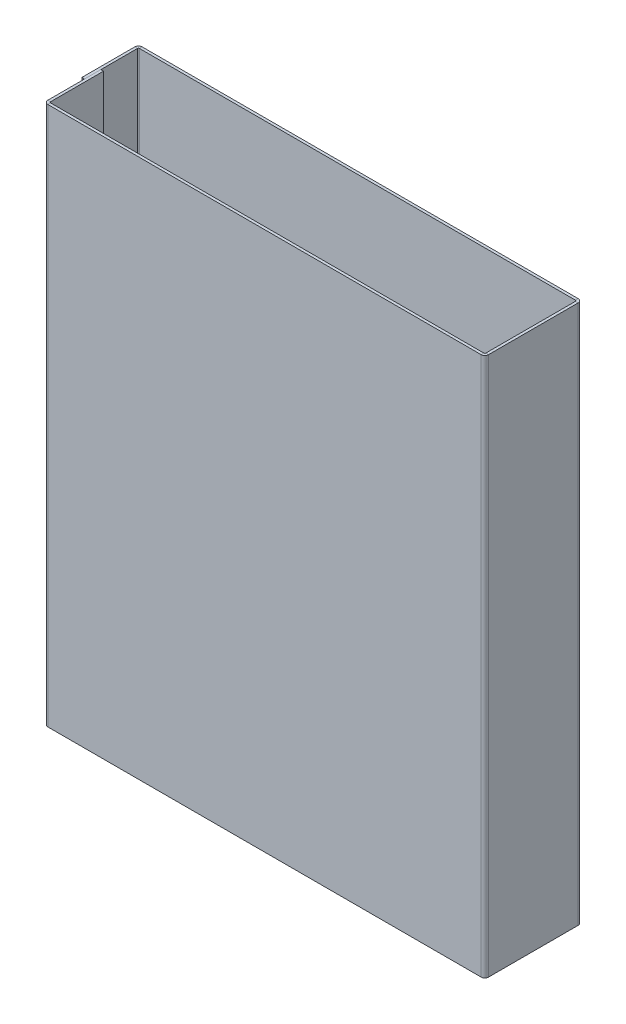
ISO-10303-21;
HEADER;
FILE_DESCRIPTION(('STEP AP214'),'2;1');
FILE_NAME('part.step','',(''),(''),'','','');
FILE_SCHEMA(('AUTOMOTIVE_DESIGN { 1 0 10303 214 1 1 1 1 }'));
ENDSEC;
DATA;
#1=APPLICATION_CONTEXT('core data for automotive mechanical design processes');
#2=APPLICATION_PROTOCOL_DEFINITION('international standard','automotive_design',2000,#1);
#3=PRODUCT_CONTEXT('',#1,'mechanical');
#4=PRODUCT('Part','Part','',(#3));
#5=PRODUCT_RELATED_PRODUCT_CATEGORY('part','',(#4));
#6=PRODUCT_DEFINITION_FORMATION('','',#4);
#7=PRODUCT_DEFINITION_CONTEXT('part definition',#1,'design');
#8=PRODUCT_DEFINITION('design','',#6,#7);
#9=PRODUCT_DEFINITION_SHAPE('','',#8);
#10=(LENGTH_UNIT() NAMED_UNIT(*) SI_UNIT(.MILLI.,.METRE.));
#11=(NAMED_UNIT(*) PLANE_ANGLE_UNIT() SI_UNIT($,.RADIAN.));
#12=(NAMED_UNIT(*) SI_UNIT($,.STERADIAN.) SOLID_ANGLE_UNIT());
#13=UNCERTAINTY_MEASURE_WITH_UNIT(LENGTH_MEASURE(1.E-05),#10,'distance_accuracy_value','');
#14=(GEOMETRIC_REPRESENTATION_CONTEXT(3) GLOBAL_UNCERTAINTY_ASSIGNED_CONTEXT((#13)) GLOBAL_UNIT_ASSIGNED_CONTEXT((#10,
#11,#12)) REPRESENTATION_CONTEXT('',''));
#15=CARTESIAN_POINT('',(0.,0.,0.));
#16=DIRECTION('',(0.,0.,1.));
#17=DIRECTION('',(1.,0.,0.));
#18=AXIS2_PLACEMENT_3D('',#15,#16,#17);
#19=CARTESIAN_POINT('',(-163.5,200.,2.));
#20=DIRECTION('',(0.,-1.,0.));
#21=DIRECTION('',(0.,0.,-1.));
#22=AXIS2_PLACEMENT_3D('',#19,#20,#21);
#23=PLANE('',#22);
#24=DIRECTION('',(0.,0.,-1.));
#25=VECTOR('',#24,1.);
#26=CARTESIAN_POINT('',(-162.7634,200.,1.99999999999999));
#27=LINE('',#26,#25);
#28=CARTESIAN_POINT('',(-162.7634,200.,1.99999999999999));
#29=VERTEX_POINT('',#28);
#30=CARTESIAN_POINT('',(-162.7634,200.,0.));
#31=VERTEX_POINT('',#30);
#32=EDGE_CURVE('E289',#29,#31,#27,.T.);
#33=ORIENTED_EDGE('',*,*,#32,.F.);
#34=DIRECTION('',(-1.,0.,0.));
#35=VECTOR('',#34,1.);
#36=CARTESIAN_POINT('',(-163.5,200.,2.));
#37=LINE('',#36,#35);
#38=CARTESIAN_POINT('',(160.7634,200.,2.));
#39=VERTEX_POINT('',#38);
#40=EDGE_CURVE('E101',#39,#29,#37,.T.);
#41=ORIENTED_EDGE('',*,*,#40,.F.);
#42=DIRECTION('',(0.,0.,-1.));
#43=VECTOR('',#42,1.);
#44=CARTESIAN_POINT('',(160.7634,200.,2.));
#45=LINE('',#44,#43);
#46=CARTESIAN_POINT('',(160.7634,200.,0.));
#47=VERTEX_POINT('',#46);
#48=EDGE_CURVE('E413',#39,#47,#45,.T.);
#49=ORIENTED_EDGE('',*,*,#48,.T.);
#50=DIRECTION('',(-1.,0.,0.));
#51=VECTOR('',#50,1.);
#52=CARTESIAN_POINT('',(-163.5,200.,0.));
#53=LINE('',#52,#51);
#54=EDGE_CURVE('E427',#47,#31,#53,.T.);
#55=ORIENTED_EDGE('',*,*,#54,.T.);
#56=EDGE_LOOP('',(#33,#41,#49,#55));
#57=FACE_BOUND('',#56,.T.);
#58=ADVANCED_FACE('F93',(#57),#23,.F.);
#59=CARTESIAN_POINT('',(-163.5,-200.,2.));
#60=DIRECTION('',(0.,1.,0.));
#61=DIRECTION('',(0.,0.,1.));
#62=AXIS2_PLACEMENT_3D('',#59,#60,#61);
#63=PLANE('',#62);
#64=DIRECTION('',(0.,0.,-1.));
#65=VECTOR('',#64,1.);
#66=CARTESIAN_POINT('',(-162.7634,-200.,1.99999999999999));
#67=LINE('',#66,#65);
#68=CARTESIAN_POINT('',(-162.7634,-200.,1.99999999999999));
#69=VERTEX_POINT('',#68);
#70=CARTESIAN_POINT('',(-162.7634,-200.,0.));
#71=VERTEX_POINT('',#70);
#72=EDGE_CURVE('E282',#69,#71,#67,.T.);
#73=ORIENTED_EDGE('',*,*,#72,.T.);
#74=DIRECTION('',(1.,0.,0.));
#75=VECTOR('',#74,1.);
#76=CARTESIAN_POINT('',(-163.5,-200.,0.));
#77=LINE('',#76,#75);
#78=CARTESIAN_POINT('',(160.7634,-200.,0.));
#79=VERTEX_POINT('',#78);
#80=EDGE_CURVE('E96',#71,#79,#77,.T.);
#81=ORIENTED_EDGE('',*,*,#80,.T.);
#82=DIRECTION('',(0.,0.,-1.));
#83=VECTOR('',#82,1.);
#84=CARTESIAN_POINT('',(160.7634,-200.,2.));
#85=LINE('',#84,#83);
#86=CARTESIAN_POINT('',(160.7634,-200.,2.));
#87=VERTEX_POINT('',#86);
#88=EDGE_CURVE('E424',#87,#79,#85,.T.);
#89=ORIENTED_EDGE('',*,*,#88,.F.);
#90=DIRECTION('',(1.,0.,0.));
#91=VECTOR('',#90,1.);
#92=CARTESIAN_POINT('',(-163.5,-200.,2.));
#93=LINE('',#92,#91);
#94=EDGE_CURVE('E13',#69,#87,#93,.T.);
#95=ORIENTED_EDGE('',*,*,#94,.F.);
#96=EDGE_LOOP('',(#73,#81,#89,#95));
#97=FACE_BOUND('',#96,.T.);
#98=ADVANCED_FACE('F439',(#97),#63,.F.);
#99=CARTESIAN_POINT('',(163.5,200.,2.));
#100=DIRECTION('',(0.,0.,-1.));
#101=DIRECTION('',(-1.,0.,0.));
#102=AXIS2_PLACEMENT_3D('',#99,#100,#101);
#103=PLANE('',#102);
#104=DIRECTION('',(0.,-1.,0.));
#105=VECTOR('',#104,1.);
#106=CARTESIAN_POINT('',(-162.7634,-200.,1.99999999999999));
#107=LINE('',#106,#105);
#108=EDGE_CURVE('E286',#69,#29,#107,.F.);
#109=ORIENTED_EDGE('',*,*,#108,.F.);
#110=ORIENTED_EDGE('',*,*,#94,.T.);
#111=DIRECTION('',(0.,1.,0.));
#112=VECTOR('',#111,1.);
#113=CARTESIAN_POINT('',(160.7634,200.,2.));
#114=LINE('',#113,#112);
#115=EDGE_CURVE('E419',#39,#87,#114,.F.);
#116=ORIENTED_EDGE('',*,*,#115,.F.);
#117=ORIENTED_EDGE('',*,*,#40,.T.);
#118=EDGE_LOOP('',(#109,#110,#116,#117));
#119=FACE_BOUND('',#118,.T.);
#120=ADVANCED_FACE('F452',(#119),#103,.F.);
#121=CARTESIAN_POINT('',(163.5,200.,0.));
#122=DIRECTION('',(0.,0.,-1.));
#123=DIRECTION('',(-1.,0.,0.));
#124=AXIS2_PLACEMENT_3D('',#121,#122,#123);
#125=PLANE('',#124);
#126=ORIENTED_EDGE('',*,*,#80,.F.);
#127=DIRECTION('',(0.,-1.,0.));
#128=VECTOR('',#127,1.);
#129=CARTESIAN_POINT('',(-162.7634,-200.,0.));
#130=LINE('',#129,#128);
#131=EDGE_CURVE('E236',#71,#31,#130,.F.);
#132=ORIENTED_EDGE('',*,*,#131,.T.);
#133=ORIENTED_EDGE('',*,*,#54,.F.);
#134=DIRECTION('',(0.,1.,0.));
#135=VECTOR('',#134,1.);
#136=CARTESIAN_POINT('',(160.7634,200.,0.));
#137=LINE('',#136,#135);
#138=EDGE_CURVE('E406',#47,#79,#137,.F.);
#139=ORIENTED_EDGE('',*,*,#138,.T.);
#140=EDGE_LOOP('',(#126,#132,#133,#139));
#141=FACE_BOUND('',#140,.T.);
#142=ADVANCED_FACE('F449',(#141),#125,.T.);
#143=CARTESIAN_POINT('',(-163.5,200.,72.0000000000023));
#144=DIRECTION('',(0.,-1.,0.));
#145=DIRECTION('',(0.,0.,-1.));
#146=AXIS2_PLACEMENT_3D('',#143,#144,#145);
#147=PLANE('',#146);
#148=DIRECTION('',(0.,0.,1.));
#149=VECTOR('',#148,1.);
#150=CARTESIAN_POINT('',(-160.7634,200.,70.0000000000023));
#151=LINE('',#150,#149);
#152=CARTESIAN_POINT('',(-160.7634,200.,70.0000000000023));
#153=VERTEX_POINT('',#152);
#154=CARTESIAN_POINT('',(-160.7634,200.,72.0000000000023));
#155=VERTEX_POINT('',#154);
#156=EDGE_CURVE('E329',#153,#155,#151,.T.);
#157=ORIENTED_EDGE('',*,*,#156,.T.);
#158=DIRECTION('',(-1.,0.,0.));
#159=VECTOR('',#158,1.);
#160=CARTESIAN_POINT('',(161.5,200.,72.));
#161=LINE('',#160,#159);
#162=CARTESIAN_POINT('',(160.7634,200.,72.));
#163=VERTEX_POINT('',#162);
#164=EDGE_CURVE('E347',#163,#155,#161,.T.);
#165=ORIENTED_EDGE('',*,*,#164,.F.);
#166=DIRECTION('',(0.,0.,-1.));
#167=VECTOR('',#166,1.);
#168=CARTESIAN_POINT('',(160.7634,200.,70.));
#169=LINE('',#168,#167);
#170=CARTESIAN_POINT('',(160.7634,200.,70.));
#171=VERTEX_POINT('',#170);
#172=EDGE_CURVE('E356',#171,#163,#169,.F.);
#173=ORIENTED_EDGE('',*,*,#172,.F.);
#174=DIRECTION('',(1.,0.,0.));
#175=VECTOR('',#174,1.);
#176=CARTESIAN_POINT('',(-163.5,200.,70.0000000000023));
#177=LINE('',#176,#175);
#178=EDGE_CURVE('E351',#171,#153,#177,.F.);
#179=ORIENTED_EDGE('',*,*,#178,.T.);
#180=EDGE_LOOP('',(#157,#165,#173,#179));
#181=FACE_BOUND('',#180,.T.);
#182=ADVANCED_FACE('F451',(#181),#147,.F.);
#183=CARTESIAN_POINT('',(161.5,-200.,72.));
#184=DIRECTION('',(0.,1.,0.));
#185=DIRECTION('',(0.,0.,1.));
#186=AXIS2_PLACEMENT_3D('',#183,#184,#185);
#187=PLANE('',#186);
#188=DIRECTION('',(0.,0.,1.));
#189=VECTOR('',#188,1.);
#190=CARTESIAN_POINT('',(-160.7634,-200.,70.0000000000023));
#191=LINE('',#190,#189);
#192=CARTESIAN_POINT('',(-160.7634,-200.,70.0000000000023));
#193=VERTEX_POINT('',#192);
#194=CARTESIAN_POINT('',(-160.7634,-200.,72.0000000000023));
#195=VERTEX_POINT('',#194);
#196=EDGE_CURVE('E338',#193,#195,#191,.T.);
#197=ORIENTED_EDGE('',*,*,#196,.F.);
#198=DIRECTION('',(-1.,0.,0.));
#199=VECTOR('',#198,1.);
#200=CARTESIAN_POINT('',(161.5,-200.,70.));
#201=LINE('',#200,#199);
#202=CARTESIAN_POINT('',(160.7634,-200.,70.));
#203=VERTEX_POINT('',#202);
#204=EDGE_CURVE('E349',#193,#203,#201,.F.);
#205=ORIENTED_EDGE('',*,*,#204,.T.);
#206=DIRECTION('',(0.,0.,-1.));
#207=VECTOR('',#206,1.);
#208=CARTESIAN_POINT('',(160.7634,-200.,72.));
#209=LINE('',#208,#207);
#210=CARTESIAN_POINT('',(160.7634,-200.,72.));
#211=VERTEX_POINT('',#210);
#212=EDGE_CURVE('E341',#203,#211,#209,.F.);
#213=ORIENTED_EDGE('',*,*,#212,.T.);
#214=DIRECTION('',(1.,0.,0.));
#215=VECTOR('',#214,1.);
#216=CARTESIAN_POINT('',(161.5,-200.,72.));
#217=LINE('',#216,#215);
#218=EDGE_CURVE('E344',#195,#211,#217,.T.);
#219=ORIENTED_EDGE('',*,*,#218,.F.);
#220=EDGE_LOOP('',(#197,#205,#213,#219));
#221=FACE_BOUND('',#220,.T.);
#222=ADVANCED_FACE('F458',(#221),#187,.F.);
#223=CARTESIAN_POINT('',(161.5,-200.,72.));
#224=DIRECTION('',(0.,0.,-1.));
#225=DIRECTION('',(-1.,0.,0.));
#226=AXIS2_PLACEMENT_3D('',#223,#224,#225);
#227=PLANE('',#226);
#228=DIRECTION('',(0.,1.,0.));
#229=VECTOR('',#228,1.);
#230=CARTESIAN_POINT('',(-160.7634,200.,72.0000000000023));
#231=LINE('',#230,#229);
#232=EDGE_CURVE('E323',#155,#195,#231,.F.);
#233=ORIENTED_EDGE('',*,*,#232,.T.);
#234=ORIENTED_EDGE('',*,*,#218,.T.);
#235=DIRECTION('',(0.,1.,0.));
#236=VECTOR('',#235,1.);
#237=CARTESIAN_POINT('',(160.7634,-200.,72.));
#238=LINE('',#237,#236);
#239=EDGE_CURVE('E353',#163,#211,#238,.F.);
#240=ORIENTED_EDGE('',*,*,#239,.F.);
#241=ORIENTED_EDGE('',*,*,#164,.T.);
#242=EDGE_LOOP('',(#233,#234,#240,#241));
#243=FACE_BOUND('',#242,.T.);
#244=ADVANCED_FACE('F548',(#243),#227,.F.);
#245=CARTESIAN_POINT('',(161.5,-200.,70.));
#246=DIRECTION('',(0.,0.,-1.));
#247=DIRECTION('',(-1.,0.,0.));
#248=AXIS2_PLACEMENT_3D('',#245,#246,#247);
#249=PLANE('',#248);
#250=ORIENTED_EDGE('',*,*,#204,.F.);
#251=DIRECTION('',(0.,1.,0.));
#252=VECTOR('',#251,1.);
#253=CARTESIAN_POINT('',(-160.7634,200.,70.0000000000023));
#254=LINE('',#253,#252);
#255=EDGE_CURVE('E117',#153,#193,#254,.F.);
#256=ORIENTED_EDGE('',*,*,#255,.F.);
#257=ORIENTED_EDGE('',*,*,#178,.F.);
#258=DIRECTION('',(0.,1.,0.));
#259=VECTOR('',#258,1.);
#260=CARTESIAN_POINT('',(160.7634,-200.,70.));
#261=LINE('',#260,#259);
#262=EDGE_CURVE('E359',#203,#171,#261,.T.);
#263=ORIENTED_EDGE('',*,*,#262,.F.);
#264=EDGE_LOOP('',(#250,#256,#257,#263));
#265=FACE_BOUND('',#264,.T.);
#266=ADVANCED_FACE('F498',(#265),#249,.T.);
#267=CARTESIAN_POINT('',(163.5,200.,72.));
#268=DIRECTION('',(0.,-1.,0.));
#269=DIRECTION('',(0.,0.,-1.));
#270=AXIS2_PLACEMENT_3D('',#267,#268,#269);
#271=PLANE('',#270);
#272=DIRECTION('',(1.,0.,0.));
#273=VECTOR('',#272,1.);
#274=CARTESIAN_POINT('',(161.5,200.,69.2634));
#275=LINE('',#274,#273);
#276=CARTESIAN_POINT('',(161.5,200.,69.2634));
#277=VERTEX_POINT('',#276);
#278=CARTESIAN_POINT('',(163.5,200.,69.2634));
#279=VERTEX_POINT('',#278);
#280=EDGE_CURVE('E369',#277,#279,#275,.T.);
#281=ORIENTED_EDGE('',*,*,#280,.T.);
#282=DIRECTION('',(0.,0.,1.));
#283=VECTOR('',#282,1.);
#284=CARTESIAN_POINT('',(163.5,200.,1.99999999999999));
#285=LINE('',#284,#283);
#286=CARTESIAN_POINT('',(163.5,200.,2.7366));
#287=VERTEX_POINT('',#286);
#288=EDGE_CURVE('E389',#287,#279,#285,.T.);
#289=ORIENTED_EDGE('',*,*,#288,.F.);
#290=DIRECTION('',(-1.,0.,0.));
#291=VECTOR('',#290,1.);
#292=CARTESIAN_POINT('',(161.5,200.,2.73660000000001));
#293=LINE('',#292,#291);
#294=CARTESIAN_POINT('',(161.5,200.,2.73660000000001));
#295=VERTEX_POINT('',#294);
#296=EDGE_CURVE('E399',#295,#287,#293,.F.);
#297=ORIENTED_EDGE('',*,*,#296,.F.);
#298=DIRECTION('',(0.,0.,-1.));
#299=VECTOR('',#298,1.);
#300=CARTESIAN_POINT('',(161.5,200.,72.));
#301=LINE('',#300,#299);
#302=EDGE_CURVE('E393',#295,#277,#301,.F.);
#303=ORIENTED_EDGE('',*,*,#302,.T.);
#304=EDGE_LOOP('',(#281,#289,#297,#303));
#305=FACE_BOUND('',#304,.T.);
#306=ADVANCED_FACE('F482',(#305),#271,.F.);
#307=CARTESIAN_POINT('',(163.5,-200.,1.99999999999999));
#308=DIRECTION('',(0.,1.,0.));
#309=DIRECTION('',(0.,0.,1.));
#310=AXIS2_PLACEMENT_3D('',#307,#308,#309);
#311=PLANE('',#310);
#312=DIRECTION('',(1.,0.,0.));
#313=VECTOR('',#312,1.);
#314=CARTESIAN_POINT('',(161.5,-200.,69.2634));
#315=LINE('',#314,#313);
#316=CARTESIAN_POINT('',(161.5,-200.,69.2634));
#317=VERTEX_POINT('',#316);
#318=CARTESIAN_POINT('',(163.5,-200.,69.2634));
#319=VERTEX_POINT('',#318);
#320=EDGE_CURVE('E380',#317,#319,#315,.T.);
#321=ORIENTED_EDGE('',*,*,#320,.F.);
#322=DIRECTION('',(0.,0.,1.));
#323=VECTOR('',#322,1.);
#324=CARTESIAN_POINT('',(161.5,-200.,2.));
#325=LINE('',#324,#323);
#326=CARTESIAN_POINT('',(161.5,-200.,2.73660000000001));
#327=VERTEX_POINT('',#326);
#328=EDGE_CURVE('E391',#317,#327,#325,.F.);
#329=ORIENTED_EDGE('',*,*,#328,.T.);
#330=DIRECTION('',(-1.,0.,0.));
#331=VECTOR('',#330,1.);
#332=CARTESIAN_POINT('',(163.5,-200.,2.7366));
#333=LINE('',#332,#331);
#334=CARTESIAN_POINT('',(163.5,-200.,2.7366));
#335=VERTEX_POINT('',#334);
#336=EDGE_CURVE('E383',#327,#335,#333,.F.);
#337=ORIENTED_EDGE('',*,*,#336,.T.);
#338=DIRECTION('',(0.,0.,-1.));
#339=VECTOR('',#338,1.);
#340=CARTESIAN_POINT('',(163.5,-200.,1.99999999999999));
#341=LINE('',#340,#339);
#342=EDGE_CURVE('E386',#319,#335,#341,.T.);
#343=ORIENTED_EDGE('',*,*,#342,.F.);
#344=EDGE_LOOP('',(#321,#329,#337,#343));
#345=FACE_BOUND('',#344,.T.);
#346=ADVANCED_FACE('F571',(#345),#311,.F.);
#347=CARTESIAN_POINT('',(163.5,200.,1.99999999999999));
#348=DIRECTION('',(-1.,0.,0.));
#349=DIRECTION('',(0.,0.,1.));
#350=AXIS2_PLACEMENT_3D('',#347,#348,#349);
#351=PLANE('',#350);
#352=DIRECTION('',(0.,1.,0.));
#353=VECTOR('',#352,1.);
#354=CARTESIAN_POINT('',(163.5,200.,69.2634));
#355=LINE('',#354,#353);
#356=EDGE_CURVE('E363',#279,#319,#355,.F.);
#357=ORIENTED_EDGE('',*,*,#356,.T.);
#358=ORIENTED_EDGE('',*,*,#342,.T.);
#359=DIRECTION('',(0.,1.,0.));
#360=VECTOR('',#359,1.);
#361=CARTESIAN_POINT('',(163.5,-200.,2.7366));
#362=LINE('',#361,#360);
#363=EDGE_CURVE('E396',#287,#335,#362,.F.);
#364=ORIENTED_EDGE('',*,*,#363,.F.);
#365=ORIENTED_EDGE('',*,*,#288,.T.);
#366=EDGE_LOOP('',(#357,#358,#364,#365));
#367=FACE_BOUND('',#366,.T.);
#368=ADVANCED_FACE('F568',(#367),#351,.F.);
#369=CARTESIAN_POINT('',(161.5,200.,2.));
#370=DIRECTION('',(-1.,0.,0.));
#371=DIRECTION('',(0.,0.,1.));
#372=AXIS2_PLACEMENT_3D('',#369,#370,#371);
#373=PLANE('',#372);
#374=ORIENTED_EDGE('',*,*,#328,.F.);
#375=DIRECTION('',(0.,1.,0.));
#376=VECTOR('',#375,1.);
#377=CARTESIAN_POINT('',(161.5,200.,69.2634));
#378=LINE('',#377,#376);
#379=EDGE_CURVE('E375',#277,#317,#378,.F.);
#380=ORIENTED_EDGE('',*,*,#379,.F.);
#381=ORIENTED_EDGE('',*,*,#302,.F.);
#382=DIRECTION('',(0.,1.,0.));
#383=VECTOR('',#382,1.);
#384=CARTESIAN_POINT('',(161.5,-200.,2.73660000000001));
#385=LINE('',#384,#383);
#386=EDGE_CURVE('E402',#327,#295,#385,.T.);
#387=ORIENTED_EDGE('',*,*,#386,.F.);
#388=EDGE_LOOP('',(#374,#380,#381,#387));
#389=FACE_BOUND('',#388,.T.);
#390=ADVANCED_FACE('F486',(#389),#373,.T.);
#391=CARTESIAN_POINT('',(160.7634,-200.,2.73660000000001));
#392=DIRECTION('',(0.,-1.,0.));
#393=DIRECTION('',(0.,0.,-1.));
#394=AXIS2_PLACEMENT_3D('',#391,#392,#393);
#395=PLANE('',#394);
#396=ORIENTED_EDGE('',*,*,#336,.F.);
#397=CARTESIAN_POINT('',(160.7634,-200.,2.73660000000001));
#398=DIRECTION('',(0.,1.,0.));
#399=DIRECTION('',(0.,0.,1.));
#400=AXIS2_PLACEMENT_3D('',#397,#398,#399);
#401=CIRCLE('',#400,0.736600000000004);
#402=EDGE_CURVE('E416',#87,#327,#401,.F.);
#403=ORIENTED_EDGE('',*,*,#402,.F.);
#404=ORIENTED_EDGE('',*,*,#88,.T.);
#405=CARTESIAN_POINT('',(160.7634,-200.,2.73660000000001));
#406=DIRECTION('',(0.,1.,0.));
#407=DIRECTION('',(0.,0.,1.));
#408=AXIS2_PLACEMENT_3D('',#405,#406,#407);
#409=CIRCLE('',#408,2.7366);
#410=EDGE_CURVE('E409',#79,#335,#409,.F.);
#411=ORIENTED_EDGE('',*,*,#410,.T.);
#412=EDGE_LOOP('',(#396,#403,#404,#411));
#413=FACE_BOUND('',#412,.T.);
#414=ADVANCED_FACE('F448',(#413),#395,.T.);
#415=CARTESIAN_POINT('',(160.7634,200.,2.73660000000001));
#416=DIRECTION('',(0.,-1.,0.));
#417=DIRECTION('',(0.,0.,-1.));
#418=AXIS2_PLACEMENT_3D('',#415,#416,#417);
#419=PLANE('',#418);
#420=CARTESIAN_POINT('',(160.7634,200.,2.73660000000001));
#421=DIRECTION('',(0.,1.,0.));
#422=DIRECTION('',(0.,0.,1.));
#423=AXIS2_PLACEMENT_3D('',#420,#421,#422);
#424=CIRCLE('',#423,0.736600000000004);
#425=EDGE_CURVE('E388',#295,#39,#424,.T.);
#426=ORIENTED_EDGE('',*,*,#425,.F.);
#427=ORIENTED_EDGE('',*,*,#296,.T.);
#428=CARTESIAN_POINT('',(160.7634,200.,2.73660000000001));
#429=DIRECTION('',(0.,1.,0.));
#430=DIRECTION('',(0.,0.,1.));
#431=AXIS2_PLACEMENT_3D('',#428,#429,#430);
#432=CIRCLE('',#431,2.7366);
#433=EDGE_CURVE('E410',#287,#47,#432,.T.);
#434=ORIENTED_EDGE('',*,*,#433,.T.);
#435=ORIENTED_EDGE('',*,*,#48,.F.);
#436=EDGE_LOOP('',(#426,#427,#434,#435));
#437=FACE_BOUND('',#436,.T.);
#438=ADVANCED_FACE('F478',(#437),#419,.F.);
#439=CARTESIAN_POINT('',(160.7634,200.,2.73660000000001));
#440=DIRECTION('',(0.,1.,0.));
#441=DIRECTION('',(1.,0.,0.));
#442=AXIS2_PLACEMENT_3D('',#439,#440,#441);
#443=CYLINDRICAL_SURFACE('',#442,2.7366);
#444=ORIENTED_EDGE('',*,*,#138,.F.);
#445=ORIENTED_EDGE('',*,*,#433,.F.);
#446=ORIENTED_EDGE('',*,*,#363,.T.);
#447=ORIENTED_EDGE('',*,*,#410,.F.);
#448=EDGE_LOOP('',(#444,#445,#446,#447));
#449=FACE_BOUND('',#448,.T.);
#450=ADVANCED_FACE('F443',(#449),#443,.T.);
#451=CARTESIAN_POINT('',(160.7634,200.,2.73660000000001));
#452=DIRECTION('',(0.,1.,0.));
#453=DIRECTION('',(1.,0.,0.));
#454=AXIS2_PLACEMENT_3D('',#451,#452,#453);
#455=CYLINDRICAL_SURFACE('',#454,0.736600000000004);
#456=ORIENTED_EDGE('',*,*,#115,.T.);
#457=ORIENTED_EDGE('',*,*,#402,.T.);
#458=ORIENTED_EDGE('',*,*,#386,.T.);
#459=ORIENTED_EDGE('',*,*,#425,.T.);
#460=EDGE_LOOP('',(#456,#457,#458,#459));
#461=FACE_BOUND('',#460,.T.);
#462=ADVANCED_FACE('F473',(#461),#455,.F.);
#463=CARTESIAN_POINT('',(160.7634,-200.,69.2634));
#464=DIRECTION('',(0.,-1.,0.));
#465=DIRECTION('',(0.,0.,-1.));
#466=AXIS2_PLACEMENT_3D('',#463,#464,#465);
#467=PLANE('',#466);
#468=ORIENTED_EDGE('',*,*,#212,.F.);
#469=CARTESIAN_POINT('',(160.7634,-200.,69.2634));
#470=DIRECTION('',(0.,1.,0.));
#471=DIRECTION('',(0.,0.,1.));
#472=AXIS2_PLACEMENT_3D('',#469,#470,#471);
#473=CIRCLE('',#472,0.736600000000004);
#474=EDGE_CURVE('E372',#317,#203,#473,.F.);
#475=ORIENTED_EDGE('',*,*,#474,.F.);
#476=ORIENTED_EDGE('',*,*,#320,.T.);
#477=CARTESIAN_POINT('',(160.7634,-200.,69.2634));
#478=DIRECTION('',(0.,1.,0.));
#479=DIRECTION('',(0.,0.,1.));
#480=AXIS2_PLACEMENT_3D('',#477,#478,#479);
#481=CIRCLE('',#480,2.7366);
#482=EDGE_CURVE('E365',#319,#211,#481,.F.);
#483=ORIENTED_EDGE('',*,*,#482,.T.);
#484=EDGE_LOOP('',(#468,#475,#476,#483));
#485=FACE_BOUND('',#484,.T.);
#486=ADVANCED_FACE('F494',(#485),#467,.T.);
#487=CARTESIAN_POINT('',(160.7634,200.,69.2634));
#488=DIRECTION('',(0.,-1.,0.));
#489=DIRECTION('',(0.,0.,-1.));
#490=AXIS2_PLACEMENT_3D('',#487,#488,#489);
#491=PLANE('',#490);
#492=CARTESIAN_POINT('',(160.7634,200.,69.2634));
#493=DIRECTION('',(0.,1.,0.));
#494=DIRECTION('',(0.,0.,1.));
#495=AXIS2_PLACEMENT_3D('',#492,#493,#494);
#496=CIRCLE('',#495,0.736600000000004);
#497=EDGE_CURVE('E346',#171,#277,#496,.T.);
#498=ORIENTED_EDGE('',*,*,#497,.F.);
#499=ORIENTED_EDGE('',*,*,#172,.T.);
#500=CARTESIAN_POINT('',(160.7634,200.,69.2634));
#501=DIRECTION('',(0.,1.,0.));
#502=DIRECTION('',(0.,0.,1.));
#503=AXIS2_PLACEMENT_3D('',#500,#501,#502);
#504=CIRCLE('',#503,2.7366);
#505=EDGE_CURVE('E366',#163,#279,#504,.T.);
#506=ORIENTED_EDGE('',*,*,#505,.T.);
#507=ORIENTED_EDGE('',*,*,#280,.F.);
#508=EDGE_LOOP('',(#498,#499,#506,#507));
#509=FACE_BOUND('',#508,.T.);
#510=ADVANCED_FACE('F559',(#509),#491,.F.);
#511=CARTESIAN_POINT('',(160.7634,200.,69.2634));
#512=DIRECTION('',(0.,1.,0.));
#513=DIRECTION('',(0.,0.,1.));
#514=AXIS2_PLACEMENT_3D('',#511,#512,#513);
#515=CYLINDRICAL_SURFACE('',#514,2.7366);
#516=ORIENTED_EDGE('',*,*,#356,.F.);
#517=ORIENTED_EDGE('',*,*,#505,.F.);
#518=ORIENTED_EDGE('',*,*,#239,.T.);
#519=ORIENTED_EDGE('',*,*,#482,.F.);
#520=EDGE_LOOP('',(#516,#517,#518,#519));
#521=FACE_BOUND('',#520,.T.);
#522=ADVANCED_FACE('F556',(#521),#515,.T.);
#523=CARTESIAN_POINT('',(160.7634,200.,69.2634));
#524=DIRECTION('',(0.,1.,0.));
#525=DIRECTION('',(0.,0.,1.));
#526=AXIS2_PLACEMENT_3D('',#523,#524,#525);
#527=CYLINDRICAL_SURFACE('',#526,0.736600000000004);
#528=ORIENTED_EDGE('',*,*,#379,.T.);
#529=ORIENTED_EDGE('',*,*,#474,.T.);
#530=ORIENTED_EDGE('',*,*,#262,.T.);
#531=ORIENTED_EDGE('',*,*,#497,.T.);
#532=EDGE_LOOP('',(#528,#529,#530,#531));
#533=FACE_BOUND('',#532,.T.);
#534=ADVANCED_FACE('F489',(#533),#527,.F.);
#535=CARTESIAN_POINT('',(-160.7634,-200.,69.2634000000023));
#536=DIRECTION('',(0.,-1.,0.));
#537=DIRECTION('',(0.,0.,-1.));
#538=AXIS2_PLACEMENT_3D('',#535,#536,#537);
#539=PLANE('',#538);
#540=DIRECTION('',(1.,0.,0.));
#541=VECTOR('',#540,1.);
#542=CARTESIAN_POINT('',(-163.5,-200.,69.2634000000023));
#543=LINE('',#542,#541);
#544=CARTESIAN_POINT('',(-161.5,-200.,69.2634000000023));
#545=VERTEX_POINT('',#544);
#546=CARTESIAN_POINT('',(-163.5,-200.,69.2634000000023));
#547=VERTEX_POINT('',#546);
#548=EDGE_CURVE('E291',#545,#547,#543,.F.);
#549=ORIENTED_EDGE('',*,*,#548,.F.);
#550=CARTESIAN_POINT('',(-160.7634,-200.,69.2634000000023));
#551=DIRECTION('',(0.,1.,0.));
#552=DIRECTION('',(0.,0.,1.));
#553=AXIS2_PLACEMENT_3D('',#550,#551,#552);
#554=CIRCLE('',#553,0.736600000000004);
#555=EDGE_CURVE('E332',#193,#545,#554,.F.);
#556=ORIENTED_EDGE('',*,*,#555,.F.);
#557=ORIENTED_EDGE('',*,*,#196,.T.);
#558=CARTESIAN_POINT('',(-160.7634,-200.,69.2634000000023));
#559=DIRECTION('',(0.,1.,0.));
#560=DIRECTION('',(0.,0.,1.));
#561=AXIS2_PLACEMENT_3D('',#558,#559,#560);
#562=CIRCLE('',#561,2.7366);
#563=EDGE_CURVE('E325',#195,#547,#562,.F.);
#564=ORIENTED_EDGE('',*,*,#563,.T.);
#565=EDGE_LOOP('',(#549,#556,#557,#564));
#566=FACE_BOUND('',#565,.T.);
#567=ADVANCED_FACE('F505',(#566),#539,.T.);
#568=CARTESIAN_POINT('',(-160.7634,200.,69.2634000000023));
#569=DIRECTION('',(0.,-1.,0.));
#570=DIRECTION('',(0.,0.,-1.));
#571=AXIS2_PLACEMENT_3D('',#568,#569,#570);
#572=PLANE('',#571);
#573=CARTESIAN_POINT('',(-160.7634,200.,69.2634000000023));
#574=DIRECTION('',(0.,1.,0.));
#575=DIRECTION('',(0.,0.,1.));
#576=AXIS2_PLACEMENT_3D('',#573,#574,#575);
#577=CIRCLE('',#576,0.736600000000004);
#578=CARTESIAN_POINT('',(-161.5,200.,69.2634000000023));
#579=VERTEX_POINT('',#578);
#580=EDGE_CURVE('E296',#579,#153,#577,.T.);
#581=ORIENTED_EDGE('',*,*,#580,.F.);
#582=DIRECTION('',(1.,0.,0.));
#583=VECTOR('',#582,1.);
#584=CARTESIAN_POINT('',(-161.5,200.,69.2634000000023));
#585=LINE('',#584,#583);
#586=CARTESIAN_POINT('',(-163.5,200.,69.2634000000023));
#587=VERTEX_POINT('',#586);
#588=EDGE_CURVE('E316',#579,#587,#585,.F.);
#589=ORIENTED_EDGE('',*,*,#588,.T.);
#590=CARTESIAN_POINT('',(-160.7634,200.,69.2634000000023));
#591=DIRECTION('',(0.,1.,0.));
#592=DIRECTION('',(0.,0.,1.));
#593=AXIS2_PLACEMENT_3D('',#590,#591,#592);
#594=CIRCLE('',#593,2.7366);
#595=EDGE_CURVE('E326',#587,#155,#594,.T.);
#596=ORIENTED_EDGE('',*,*,#595,.T.);
#597=ORIENTED_EDGE('',*,*,#156,.F.);
#598=EDGE_LOOP('',(#581,#589,#596,#597));
#599=FACE_BOUND('',#598,.T.);
#600=ADVANCED_FACE('F527',(#599),#572,.F.);
#601=CARTESIAN_POINT('',(-160.7634,200.,69.2634000000023));
#602=DIRECTION('',(0.,1.,0.));
#603=DIRECTION('',(-1.,0.,0.));
#604=AXIS2_PLACEMENT_3D('',#601,#602,#603);
#605=CYLINDRICAL_SURFACE('',#604,2.7366);
#606=ORIENTED_EDGE('',*,*,#232,.F.);
#607=ORIENTED_EDGE('',*,*,#595,.F.);
#608=DIRECTION('',(0.,1.,0.));
#609=VECTOR('',#608,1.);
#610=CARTESIAN_POINT('',(-163.5,-200.,69.2634000000023));
#611=LINE('',#610,#609);
#612=EDGE_CURVE('E314',#587,#547,#611,.F.);
#613=ORIENTED_EDGE('',*,*,#612,.T.);
#614=ORIENTED_EDGE('',*,*,#563,.F.);
#615=EDGE_LOOP('',(#606,#607,#613,#614));
#616=FACE_BOUND('',#615,.T.);
#617=ADVANCED_FACE('F537',(#616),#605,.T.);
#618=CARTESIAN_POINT('',(-160.7634,200.,69.2634000000023));
#619=DIRECTION('',(0.,1.,0.));
#620=DIRECTION('',(-1.,0.,0.));
#621=AXIS2_PLACEMENT_3D('',#618,#619,#620);
#622=CYLINDRICAL_SURFACE('',#621,0.736600000000004);
#623=ORIENTED_EDGE('',*,*,#255,.T.);
#624=ORIENTED_EDGE('',*,*,#555,.T.);
#625=DIRECTION('',(0.,1.,0.));
#626=VECTOR('',#625,1.);
#627=CARTESIAN_POINT('',(-161.5,-200.,69.2634000000023));
#628=LINE('',#627,#626);
#629=EDGE_CURVE('E319',#545,#579,#628,.T.);
#630=ORIENTED_EDGE('',*,*,#629,.T.);
#631=ORIENTED_EDGE('',*,*,#580,.T.);
#632=EDGE_LOOP('',(#623,#624,#630,#631));
#633=FACE_BOUND('',#632,.T.);
#634=ADVANCED_FACE('F501',(#633),#622,.F.);
#635=CARTESIAN_POINT('',(-163.5,200.,30.0000000000023));
#636=DIRECTION('',(0.,-1.,0.));
#637=DIRECTION('',(0.,0.,-1.));
#638=AXIS2_PLACEMENT_3D('',#635,#636,#637);
#639=PLANE('',#638);
#640=ORIENTED_EDGE('',*,*,#588,.F.);
#641=DIRECTION('',(0.,0.,1.));
#642=VECTOR('',#641,1.);
#643=CARTESIAN_POINT('',(-161.5,200.,30.0000000000023));
#644=LINE('',#643,#642);
#645=CARTESIAN_POINT('',(-161.5,200.,30.0000000000023));
#646=VERTEX_POINT('',#645);
#647=EDGE_CURVE('E312',#579,#646,#644,.F.);
#648=ORIENTED_EDGE('',*,*,#647,.T.);
#649=DIRECTION('',(1.,0.,0.));
#650=VECTOR('',#649,1.);
#651=CARTESIAN_POINT('',(-163.5,200.,30.0000000000023));
#652=LINE('',#651,#650);
#653=CARTESIAN_POINT('',(-163.5,200.,30.0000000000023));
#654=VERTEX_POINT('',#653);
#655=EDGE_CURVE('E293',#654,#646,#652,.T.);
#656=ORIENTED_EDGE('',*,*,#655,.F.);
#657=DIRECTION('',(0.,0.,-1.));
#658=VECTOR('',#657,1.);
#659=CARTESIAN_POINT('',(-163.5,200.,70.0000000000023));
#660=LINE('',#659,#658);
#661=EDGE_CURVE('E305',#587,#654,#660,.T.);
#662=ORIENTED_EDGE('',*,*,#661,.F.);
#663=EDGE_LOOP('',(#640,#648,#656,#662));
#664=FACE_BOUND('',#663,.T.);
#665=ADVANCED_FACE('F529',(#664),#639,.F.);
#666=CARTESIAN_POINT('',(-163.5,-200.,70.0000000000023));
#667=DIRECTION('',(0.,1.,0.));
#668=DIRECTION('',(0.,0.,1.));
#669=AXIS2_PLACEMENT_3D('',#666,#667,#668);
#670=PLANE('',#669);
#671=ORIENTED_EDGE('',*,*,#548,.T.);
#672=DIRECTION('',(0.,0.,1.));
#673=VECTOR('',#672,1.);
#674=CARTESIAN_POINT('',(-163.5,-200.,70.0000000000023));
#675=LINE('',#674,#673);
#676=CARTESIAN_POINT('',(-163.5,-200.,30.0000000000023));
#677=VERTEX_POINT('',#676);
#678=EDGE_CURVE('E300',#677,#547,#675,.T.);
#679=ORIENTED_EDGE('',*,*,#678,.F.);
#680=DIRECTION('',(1.,0.,0.));
#681=VECTOR('',#680,1.);
#682=CARTESIAN_POINT('',(-163.5,-200.,30.0000000000023));
#683=LINE('',#682,#681);
#684=CARTESIAN_POINT('',(-161.5,-200.,30.0000000000023));
#685=VERTEX_POINT('',#684);
#686=EDGE_CURVE('E297',#677,#685,#683,.T.);
#687=ORIENTED_EDGE('',*,*,#686,.T.);
#688=DIRECTION('',(0.,0.,-1.));
#689=VECTOR('',#688,1.);
#690=CARTESIAN_POINT('',(-161.5,-200.,70.0000000000023));
#691=LINE('',#690,#689);
#692=EDGE_CURVE('E307',#685,#545,#691,.F.);
#693=ORIENTED_EDGE('',*,*,#692,.T.);
#694=EDGE_LOOP('',(#671,#679,#687,#693));
#695=FACE_BOUND('',#694,.T.);
#696=ADVANCED_FACE('F509',(#695),#670,.F.);
#697=CARTESIAN_POINT('',(-163.5,200.,70.0000000000023));
#698=DIRECTION('',(1.,0.,0.));
#699=DIRECTION('',(0.,0.,-1.));
#700=AXIS2_PLACEMENT_3D('',#697,#698,#699);
#701=PLANE('',#700);
#702=ORIENTED_EDGE('',*,*,#612,.F.);
#703=ORIENTED_EDGE('',*,*,#661,.T.);
#704=DIRECTION('',(0.,-1.,0.));
#705=VECTOR('',#704,1.);
#706=CARTESIAN_POINT('',(-163.5,200.,30.0000000000023));
#707=LINE('',#706,#705);
#708=EDGE_CURVE('E303',#654,#677,#707,.T.);
#709=ORIENTED_EDGE('',*,*,#708,.T.);
#710=ORIENTED_EDGE('',*,*,#678,.T.);
#711=EDGE_LOOP('',(#702,#703,#709,#710));
#712=FACE_BOUND('',#711,.T.);
#713=ADVANCED_FACE('F513',(#712),#701,.F.);
#714=CARTESIAN_POINT('',(-161.5,200.,70.0000000000023));
#715=DIRECTION('',(1.,0.,0.));
#716=DIRECTION('',(0.,0.,-1.));
#717=AXIS2_PLACEMENT_3D('',#714,#715,#716);
#718=PLANE('',#717);
#719=ORIENTED_EDGE('',*,*,#647,.F.);
#720=ORIENTED_EDGE('',*,*,#629,.F.);
#721=ORIENTED_EDGE('',*,*,#692,.F.);
#722=DIRECTION('',(0.,1.,0.));
#723=VECTOR('',#722,1.);
#724=CARTESIAN_POINT('',(-161.5,-200.,30.0000000000023));
#725=LINE('',#724,#723);
#726=EDGE_CURVE('E310',#646,#685,#725,.F.);
#727=ORIENTED_EDGE('',*,*,#726,.F.);
#728=EDGE_LOOP('',(#719,#720,#721,#727));
#729=FACE_BOUND('',#728,.T.);
#730=ADVANCED_FACE('F523',(#729),#718,.T.);
#731=CARTESIAN_POINT('',(-163.5,-200.,30.0000000000023));
#732=DIRECTION('',(0.,0.,1.));
#733=DIRECTION('',(1.,0.,0.));
#734=AXIS2_PLACEMENT_3D('',#731,#732,#733);
#735=PLANE('',#734);
#736=ORIENTED_EDGE('',*,*,#726,.T.);
#737=ORIENTED_EDGE('',*,*,#686,.F.);
#738=ORIENTED_EDGE('',*,*,#708,.F.);
#739=ORIENTED_EDGE('',*,*,#655,.T.);
#740=EDGE_LOOP('',(#736,#737,#738,#739));
#741=FACE_BOUND('',#740,.T.);
#742=ADVANCED_FACE('F519',(#741),#735,.F.);
#743=CARTESIAN_POINT('',(-162.7634,200.,2.73659999999999));
#744=DIRECTION('',(0.,1.,0.));
#745=DIRECTION('',(0.,0.,1.));
#746=AXIS2_PLACEMENT_3D('',#743,#744,#745);
#747=PLANE('',#746);
#748=DIRECTION('',(-1.,0.,0.));
#749=VECTOR('',#748,1.);
#750=CARTESIAN_POINT('',(-163.5,200.,2.73660000000001));
#751=LINE('',#750,#749);
#752=CARTESIAN_POINT('',(-163.5,200.,2.73659999999999));
#753=VERTEX_POINT('',#752);
#754=CARTESIAN_POINT('',(-165.5,200.,2.73659999999999));
#755=VERTEX_POINT('',#754);
#756=EDGE_CURVE('E922',#753,#755,#751,.T.);
#757=ORIENTED_EDGE('',*,*,#756,.F.);
#758=CARTESIAN_POINT('',(-162.7634,200.,2.73659999999999));
#759=DIRECTION('',(0.,-1.,0.));
#760=DIRECTION('',(0.,0.,-1.));
#761=AXIS2_PLACEMENT_3D('',#758,#759,#760);
#762=CIRCLE('',#761,0.736600000000004);
#763=EDGE_CURVE('E239',#29,#753,#762,.F.);
#764=ORIENTED_EDGE('',*,*,#763,.F.);
#765=ORIENTED_EDGE('',*,*,#32,.T.);
#766=CARTESIAN_POINT('',(-162.7634,200.,2.73659999999999));
#767=DIRECTION('',(0.,-1.,0.));
#768=DIRECTION('',(0.,0.,-1.));
#769=AXIS2_PLACEMENT_3D('',#766,#767,#768);
#770=CIRCLE('',#769,2.7366);
#771=EDGE_CURVE('E109',#31,#755,#770,.F.);
#772=ORIENTED_EDGE('',*,*,#771,.T.);
#773=EDGE_LOOP('',(#757,#764,#765,#772));
#774=FACE_BOUND('',#773,.T.);
#775=ADVANCED_FACE('F674',(#774),#747,.T.);
#776=CARTESIAN_POINT('',(-162.7634,-200.,2.73659999999999));
#777=DIRECTION('',(0.,1.,0.));
#778=DIRECTION('',(0.,0.,1.));
#779=AXIS2_PLACEMENT_3D('',#776,#777,#778);
#780=PLANE('',#779);
#781=CARTESIAN_POINT('',(-162.7634,-200.,2.73659999999999));
#782=DIRECTION('',(0.,-1.,0.));
#783=DIRECTION('',(0.,0.,-1.));
#784=AXIS2_PLACEMENT_3D('',#781,#782,#783);
#785=CIRCLE('',#784,0.736600000000004);
#786=CARTESIAN_POINT('',(-163.5,-200.,2.73659999999999));
#787=VERTEX_POINT('',#786);
#788=EDGE_CURVE('E246',#787,#69,#785,.T.);
#789=ORIENTED_EDGE('',*,*,#788,.F.);
#790=DIRECTION('',(-1.,0.,0.));
#791=VECTOR('',#790,1.);
#792=CARTESIAN_POINT('',(-163.5,-200.,2.73659999999998));
#793=LINE('',#792,#791);
#794=CARTESIAN_POINT('',(-165.5,-200.,2.73659999999997));
#795=VERTEX_POINT('',#794);
#796=EDGE_CURVE('E243',#787,#795,#793,.T.);
#797=ORIENTED_EDGE('',*,*,#796,.T.);
#798=CARTESIAN_POINT('',(-162.7634,-200.,2.73659999999999));
#799=DIRECTION('',(0.,-1.,0.));
#800=DIRECTION('',(0.,0.,-1.));
#801=AXIS2_PLACEMENT_3D('',#798,#799,#800);
#802=CIRCLE('',#801,2.7366);
#803=EDGE_CURVE('E230',#795,#71,#802,.T.);
#804=ORIENTED_EDGE('',*,*,#803,.T.);
#805=ORIENTED_EDGE('',*,*,#72,.F.);
#806=EDGE_LOOP('',(#789,#797,#804,#805));
#807=FACE_BOUND('',#806,.T.);
#808=ADVANCED_FACE('F244',(#807),#780,.F.);
#809=CARTESIAN_POINT('',(-162.7634,-200.,2.73659999999999));
#810=DIRECTION('',(0.,-1.,0.));
#811=DIRECTION('',(-1.,0.,0.));
#812=AXIS2_PLACEMENT_3D('',#809,#810,#811);
#813=CYLINDRICAL_SURFACE('',#812,2.7366);
#814=ORIENTED_EDGE('',*,*,#131,.F.);
#815=ORIENTED_EDGE('',*,*,#803,.F.);
#816=DIRECTION('',(0.,1.,0.));
#817=VECTOR('',#816,1.);
#818=CARTESIAN_POINT('',(-165.5,-200.,2.73659999999997));
#819=LINE('',#818,#817);
#820=EDGE_CURVE('E234',#795,#755,#819,.T.);
#821=ORIENTED_EDGE('',*,*,#820,.T.);
#822=ORIENTED_EDGE('',*,*,#771,.F.);
#823=EDGE_LOOP('',(#814,#815,#821,#822));
#824=FACE_BOUND('',#823,.T.);
#825=ADVANCED_FACE('F232',(#824),#813,.T.);
#826=CARTESIAN_POINT('',(-162.7634,-200.,2.73659999999999));
#827=DIRECTION('',(0.,-1.,0.));
#828=DIRECTION('',(-1.,0.,0.));
#829=AXIS2_PLACEMENT_3D('',#826,#827,#828);
#830=CYLINDRICAL_SURFACE('',#829,0.736600000000004);
#831=ORIENTED_EDGE('',*,*,#108,.T.);
#832=ORIENTED_EDGE('',*,*,#763,.T.);
#833=DIRECTION('',(0.,-1.,0.));
#834=VECTOR('',#833,1.);
#835=CARTESIAN_POINT('',(-163.5,200.,2.73660000000001));
#836=LINE('',#835,#834);
#837=EDGE_CURVE('E250',#753,#787,#836,.T.);
#838=ORIENTED_EDGE('',*,*,#837,.T.);
#839=ORIENTED_EDGE('',*,*,#788,.T.);
#840=EDGE_LOOP('',(#831,#832,#838,#839));
#841=FACE_BOUND('',#840,.T.);
#842=ADVANCED_FACE('F718',(#841),#830,.F.);
#843=CARTESIAN_POINT('',(-165.5,-200.,42.));
#844=DIRECTION('',(0.,1.,0.));
#845=DIRECTION('',(0.,0.,1.));
#846=AXIS2_PLACEMENT_3D('',#843,#844,#845);
#847=PLANE('',#846);
#848=ORIENTED_EDGE('',*,*,#796,.F.);
#849=DIRECTION('',(0.,0.,1.));
#850=VECTOR('',#849,1.);
#851=CARTESIAN_POINT('',(-163.5,-200.,42.));
#852=LINE('',#851,#850);
#853=CARTESIAN_POINT('',(-163.5,-200.,42.));
#854=VERTEX_POINT('',#853);
#855=EDGE_CURVE('E259',#787,#854,#852,.T.);
#856=ORIENTED_EDGE('',*,*,#855,.T.);
#857=DIRECTION('',(1.,0.,0.));
#858=VECTOR('',#857,1.);
#859=CARTESIAN_POINT('',(-165.5,-200.,42.));
#860=LINE('',#859,#858);
#861=CARTESIAN_POINT('',(-165.5,-200.,42.));
#862=VERTEX_POINT('',#861);
#863=EDGE_CURVE('E263',#862,#854,#860,.T.);
#864=ORIENTED_EDGE('',*,*,#863,.F.);
#865=DIRECTION('',(0.,0.,1.));
#866=VECTOR('',#865,1.);
#867=CARTESIAN_POINT('',(-165.5,-200.,42.));
#868=LINE('',#867,#866);
#869=EDGE_CURVE('E255',#795,#862,#868,.T.);
#870=ORIENTED_EDGE('',*,*,#869,.F.);
#871=EDGE_LOOP('',(#848,#856,#864,#870));
#872=FACE_BOUND('',#871,.T.);
#873=ADVANCED_FACE('F261',(#872),#847,.F.);
#874=CARTESIAN_POINT('',(-165.5,200.,1.99999999999999));
#875=DIRECTION('',(0.,-1.,0.));
#876=DIRECTION('',(0.,0.,-1.));
#877=AXIS2_PLACEMENT_3D('',#874,#875,#876);
#878=PLANE('',#877);
#879=ORIENTED_EDGE('',*,*,#756,.T.);
#880=DIRECTION('',(0.,0.,-1.));
#881=VECTOR('',#880,1.);
#882=CARTESIAN_POINT('',(-165.5,200.,1.99999999999999));
#883=LINE('',#882,#881);
#884=CARTESIAN_POINT('',(-165.5,200.,42.));
#885=VERTEX_POINT('',#884);
#886=EDGE_CURVE('E258',#885,#755,#883,.T.);
#887=ORIENTED_EDGE('',*,*,#886,.F.);
#888=DIRECTION('',(1.,0.,0.));
#889=VECTOR('',#888,1.);
#890=CARTESIAN_POINT('',(-165.5,200.,42.));
#891=LINE('',#890,#889);
#892=CARTESIAN_POINT('',(-163.5,200.,42.));
#893=VERTEX_POINT('',#892);
#894=EDGE_CURVE('E275',#885,#893,#891,.T.);
#895=ORIENTED_EDGE('',*,*,#894,.T.);
#896=DIRECTION('',(0.,0.,-1.));
#897=VECTOR('',#896,1.);
#898=CARTESIAN_POINT('',(-163.5,200.,2.));
#899=LINE('',#898,#897);
#900=EDGE_CURVE('E266',#893,#753,#899,.T.);
#901=ORIENTED_EDGE('',*,*,#900,.T.);
#902=EDGE_LOOP('',(#879,#887,#895,#901));
#903=FACE_BOUND('',#902,.T.);
#904=ADVANCED_FACE('F746',(#903),#878,.F.);
#905=CARTESIAN_POINT('',(-165.5,-200.,1.99999999999999));
#906=DIRECTION('',(1.,0.,0.));
#907=DIRECTION('',(0.,0.,-1.));
#908=AXIS2_PLACEMENT_3D('',#905,#906,#907);
#909=PLANE('',#908);
#910=ORIENTED_EDGE('',*,*,#820,.F.);
#911=ORIENTED_EDGE('',*,*,#869,.T.);
#912=DIRECTION('',(0.,1.,0.));
#913=VECTOR('',#912,1.);
#914=CARTESIAN_POINT('',(-165.5,200.,42.));
#915=LINE('',#914,#913);
#916=EDGE_CURVE('E265',#862,#885,#915,.T.);
#917=ORIENTED_EDGE('',*,*,#916,.T.);
#918=ORIENTED_EDGE('',*,*,#886,.T.);
#919=EDGE_LOOP('',(#910,#911,#917,#918));
#920=FACE_BOUND('',#919,.T.);
#921=ADVANCED_FACE('F254',(#920),#909,.F.);
#922=CARTESIAN_POINT('',(-163.5,-200.,2.));
#923=DIRECTION('',(1.,0.,0.));
#924=DIRECTION('',(0.,0.,-1.));
#925=AXIS2_PLACEMENT_3D('',#922,#923,#924);
#926=PLANE('',#925);
#927=ORIENTED_EDGE('',*,*,#855,.F.);
#928=ORIENTED_EDGE('',*,*,#837,.F.);
#929=ORIENTED_EDGE('',*,*,#900,.F.);
#930=DIRECTION('',(0.,1.,0.));
#931=VECTOR('',#930,1.);
#932=CARTESIAN_POINT('',(-163.5,200.,42.));
#933=LINE('',#932,#931);
#934=EDGE_CURVE('E270',#854,#893,#933,.T.);
#935=ORIENTED_EDGE('',*,*,#934,.F.);
#936=EDGE_LOOP('',(#927,#928,#929,#935));
#937=FACE_BOUND('',#936,.T.);
#938=ADVANCED_FACE('F766',(#937),#926,.T.);
#939=CARTESIAN_POINT('',(-165.5,200.,42.));
#940=DIRECTION('',(0.,0.,-1.));
#941=DIRECTION('',(-1.,0.,0.));
#942=AXIS2_PLACEMENT_3D('',#939,#940,#941);
#943=PLANE('',#942);
#944=ORIENTED_EDGE('',*,*,#934,.T.);
#945=ORIENTED_EDGE('',*,*,#894,.F.);
#946=ORIENTED_EDGE('',*,*,#916,.F.);
#947=ORIENTED_EDGE('',*,*,#863,.T.);
#948=EDGE_LOOP('',(#944,#945,#946,#947));
#949=FACE_BOUND('',#948,.T.);
#950=ADVANCED_FACE('F776',(#949),#943,.F.);
#951=CLOSED_SHELL('',(#58,#98,#120,#142,#182,#222,#244,#266,#306,#346,#368,#390,#414,#438,#450,
#462,#486,#510,#522,#534,#567,#600,#617,#634,#665,#696,#713,#730,#742,#775,#808,#825,#842,#873,
#904,#921,#938,#950));
#952=MANIFOLD_SOLID_BREP('B2',#951);
#953=ADVANCED_BREP_SHAPE_REPRESENTATION('',(#18,#952),#14);
#954=SHAPE_DEFINITION_REPRESENTATION(#9,#953);
ENDSEC;
END-ISO-10303-21;
